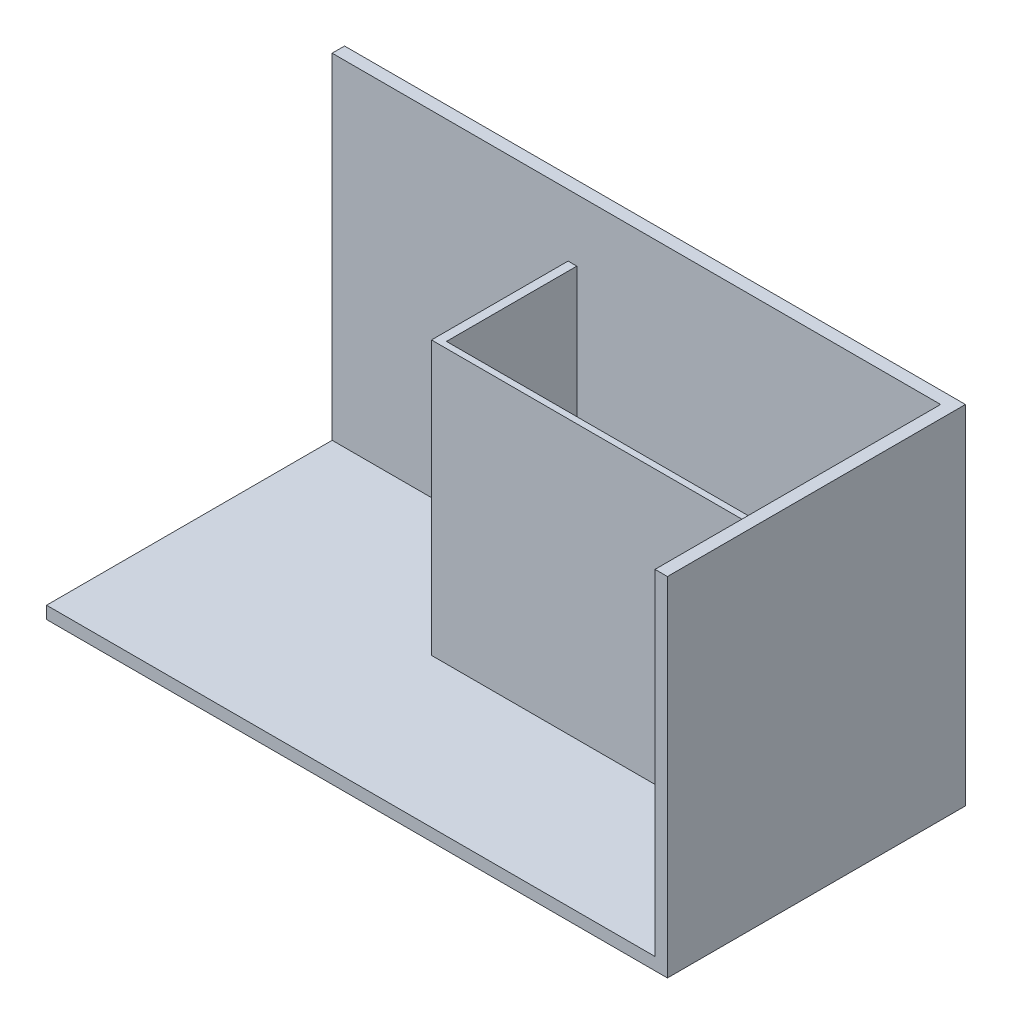
ISO-10303-21;
HEADER;
FILE_DESCRIPTION(('STEP AP214'),'2;1');
FILE_NAME('part.step','',(''),(''),'','','');
FILE_SCHEMA(('AUTOMOTIVE_DESIGN { 1 0 10303 214 1 1 1 1 }'));
ENDSEC;
DATA;
#1=APPLICATION_CONTEXT('core data for automotive mechanical design processes');
#2=APPLICATION_PROTOCOL_DEFINITION('international standard','automotive_design',2000,#1);
#3=PRODUCT_CONTEXT('',#1,'mechanical');
#4=PRODUCT('Part','Part','',(#3));
#5=PRODUCT_RELATED_PRODUCT_CATEGORY('part','',(#4));
#6=PRODUCT_DEFINITION_FORMATION('','',#4);
#7=PRODUCT_DEFINITION_CONTEXT('part definition',#1,'design');
#8=PRODUCT_DEFINITION('design','',#6,#7);
#9=PRODUCT_DEFINITION_SHAPE('','',#8);
#10=(LENGTH_UNIT() NAMED_UNIT(*) SI_UNIT(.MILLI.,.METRE.));
#11=(NAMED_UNIT(*) PLANE_ANGLE_UNIT() SI_UNIT($,.RADIAN.));
#12=(NAMED_UNIT(*) SI_UNIT($,.STERADIAN.) SOLID_ANGLE_UNIT());
#13=UNCERTAINTY_MEASURE_WITH_UNIT(LENGTH_MEASURE(1.E-05),#10,'distance_accuracy_value','');
#14=(GEOMETRIC_REPRESENTATION_CONTEXT(3) GLOBAL_UNCERTAINTY_ASSIGNED_CONTEXT((#13)) GLOBAL_UNIT_ASSIGNED_CONTEXT((#10,
#11,#12)) REPRESENTATION_CONTEXT('',''));
#15=CARTESIAN_POINT('',(0.,0.,0.));
#16=DIRECTION('',(0.,0.,1.));
#17=DIRECTION('',(1.,0.,0.));
#18=AXIS2_PLACEMENT_3D('',#15,#16,#17);
#19=CARTESIAN_POINT('',(0.,0.,0.));
#20=DIRECTION('',(0.,1.,0.));
#21=DIRECTION('',(0.,0.,1.));
#22=AXIS2_PLACEMENT_3D('',#19,#20,#21);
#23=PLANE('',#22);
#24=DIRECTION('',(0.,0.,-1.));
#25=VECTOR('',#24,1.);
#26=CARTESIAN_POINT('',(4833.64590230241,0.,-2344.42844317827));
#27=LINE('',#26,#25);
#28=CARTESIAN_POINT('',(4833.64590230241,0.,55.571556821729));
#29=VERTEX_POINT('',#28);
#30=CARTESIAN_POINT('',(4833.64590230241,0.,-1144.42844317827));
#31=VERTEX_POINT('',#30);
#32=EDGE_CURVE('E180',#29,#31,#27,.T.);
#33=ORIENTED_EDGE('',*,*,#32,.T.);
#34=DIRECTION('',(1.,0.,0.));
#35=VECTOR('',#34,1.);
#36=CARTESIAN_POINT('',(1833.64590230241,0.,-1144.42844317827));
#37=LINE('',#36,#35);
#38=CARTESIAN_POINT('',(1833.64590230241,0.,-1144.42844317827));
#39=VERTEX_POINT('',#38);
#40=EDGE_CURVE('E143',#39,#31,#37,.T.);
#41=ORIENTED_EDGE('',*,*,#40,.F.);
#42=DIRECTION('',(0.,0.,1.));
#43=VECTOR('',#42,1.);
#44=CARTESIAN_POINT('',(1833.64590230241,0.,-2244.42844317827));
#45=LINE('',#44,#43);
#46=CARTESIAN_POINT('',(1833.64590230241,0.,-2244.42844317827));
#47=VERTEX_POINT('',#46);
#48=EDGE_CURVE('E137',#47,#39,#45,.T.);
#49=ORIENTED_EDGE('',*,*,#48,.F.);
#50=DIRECTION('',(-1.,0.,0.));
#51=VECTOR('',#50,1.);
#52=CARTESIAN_POINT('',(4933.64590230241,0.,-2244.42844317827));
#53=LINE('',#52,#51);
#54=CARTESIAN_POINT('',(-66.3540976975871,0.,-2244.42844317827));
#55=VERTEX_POINT('',#54);
#56=EDGE_CURVE('E190',#47,#55,#53,.T.);
#57=ORIENTED_EDGE('',*,*,#56,.T.);
#58=DIRECTION('',(0.,0.,1.));
#59=VECTOR('',#58,1.);
#60=CARTESIAN_POINT('',(-66.3540976975871,0.,-2344.42844317827));
#61=LINE('',#60,#59);
#62=CARTESIAN_POINT('',(-66.3540976975868,0.,55.571556821729));
#63=VERTEX_POINT('',#62);
#64=EDGE_CURVE('E202',#55,#63,#61,.T.);
#65=ORIENTED_EDGE('',*,*,#64,.T.);
#66=DIRECTION('',(1.,0.,0.));
#67=VECTOR('',#66,1.);
#68=CARTESIAN_POINT('',(-66.3540976975868,0.,55.571556821729));
#69=LINE('',#68,#67);
#70=EDGE_CURVE('E209',#63,#29,#69,.T.);
#71=ORIENTED_EDGE('',*,*,#70,.T.);
#72=EDGE_LOOP('',(#33,#41,#49,#57,#65,#71));
#73=FACE_BOUND('',#72,.T.);
#74=ADVANCED_FACE('F35',(#73),#23,.T.);
#75=DIRECTION('',(0.,0.,-1.));
#76=VECTOR('',#75,1.);
#77=CARTESIAN_POINT('',(1904.0489280238,0.,-2244.42844317827));
#78=LINE('',#77,#76);
#79=CARTESIAN_POINT('',(1904.0489280238,0.,-1194.42844317827));
#80=VERTEX_POINT('',#79);
#81=CARTESIAN_POINT('',(1904.0489280238,0.,-2244.42844317827));
#82=VERTEX_POINT('',#81);
#83=EDGE_CURVE('E166',#80,#82,#78,.T.);
#84=ORIENTED_EDGE('',*,*,#83,.F.);
#85=DIRECTION('',(-1.,0.,0.));
#86=VECTOR('',#85,1.);
#87=CARTESIAN_POINT('',(1833.64590230241,0.,-1194.42844317827));
#88=LINE('',#87,#86);
#89=CARTESIAN_POINT('',(4833.64590230241,0.,-1194.42844317827));
#90=VERTEX_POINT('',#89);
#91=EDGE_CURVE('E153',#90,#80,#88,.T.);
#92=ORIENTED_EDGE('',*,*,#91,.F.);
#93=CARTESIAN_POINT('',(4833.64590230241,0.,-2244.42844317827));
#94=VERTEX_POINT('',#93);
#95=EDGE_CURVE('E179',#90,#94,#27,.T.);
#96=ORIENTED_EDGE('',*,*,#95,.T.);
#97=EDGE_CURVE('E186',#94,#82,#53,.T.);
#98=ORIENTED_EDGE('',*,*,#97,.T.);
#99=EDGE_LOOP('',(#84,#92,#96,#98));
#100=FACE_BOUND('',#99,.T.);
#101=ADVANCED_FACE('F261',(#100),#23,.T.);
#102=CARTESIAN_POINT('',(4833.64590230241,0.,0.));
#103=DIRECTION('',(1.,0.,0.));
#104=DIRECTION('',(0.,0.,-1.));
#105=AXIS2_PLACEMENT_3D('',#102,#103,#104);
#106=PLANE('',#105);
#107=DIRECTION('',(0.,-1.,0.));
#108=VECTOR('',#107,1.);
#109=CARTESIAN_POINT('',(4833.64590230241,2200.,-1144.42844317827));
#110=LINE('',#109,#108);
#111=CARTESIAN_POINT('',(4833.64590230241,2200.,-1144.42844317827));
#112=VERTEX_POINT('',#111);
#113=EDGE_CURVE('E140',#112,#31,#110,.T.);
#114=ORIENTED_EDGE('',*,*,#113,.T.);
#115=ORIENTED_EDGE('',*,*,#32,.F.);
#116=DIRECTION('',(0.,-1.,0.));
#117=VECTOR('',#116,1.);
#118=CARTESIAN_POINT('',(4833.64590230241,0.,55.571556821729));
#119=LINE('',#118,#117);
#120=CARTESIAN_POINT('',(4833.64590230241,2700.,55.571556821729));
#121=VERTEX_POINT('',#120);
#122=EDGE_CURVE('E177',#121,#29,#119,.T.);
#123=ORIENTED_EDGE('',*,*,#122,.F.);
#124=DIRECTION('',(0.,0.,1.));
#125=VECTOR('',#124,1.);
#126=CARTESIAN_POINT('',(4833.64590230241,2700.,-2344.42844317827));
#127=LINE('',#126,#125);
#128=CARTESIAN_POINT('',(4833.64590230241,2700.,-2244.42844317827));
#129=VERTEX_POINT('',#128);
#130=EDGE_CURVE('E175',#129,#121,#127,.T.);
#131=ORIENTED_EDGE('',*,*,#130,.F.);
#132=DIRECTION('',(0.,1.,0.));
#133=VECTOR('',#132,1.);
#134=CARTESIAN_POINT('',(4833.64590230241,0.,-2244.42844317827));
#135=LINE('',#134,#133);
#136=EDGE_CURVE('E11',#94,#129,#135,.T.);
#137=ORIENTED_EDGE('',*,*,#136,.F.);
#138=ORIENTED_EDGE('',*,*,#95,.F.);
#139=DIRECTION('',(0.,-1.,0.));
#140=VECTOR('',#139,1.);
#141=CARTESIAN_POINT('',(4833.64590230241,2200.,-1194.42844317827));
#142=LINE('',#141,#140);
#143=CARTESIAN_POINT('',(4833.64590230241,2200.,-1194.42844317827));
#144=VERTEX_POINT('',#143);
#145=EDGE_CURVE('E148',#144,#90,#142,.T.);
#146=ORIENTED_EDGE('',*,*,#145,.F.);
#147=DIRECTION('',(0.,0.,-1.));
#148=VECTOR('',#147,1.);
#149=CARTESIAN_POINT('',(4833.64590230241,2200.,-1144.42844317827));
#150=LINE('',#149,#148);
#151=EDGE_CURVE('E131',#112,#144,#150,.T.);
#152=ORIENTED_EDGE('',*,*,#151,.F.);
#153=EDGE_LOOP('',(#114,#115,#123,#131,#137,#138,#146,#152));
#154=FACE_BOUND('',#153,.T.);
#155=ADVANCED_FACE('F151',(#154),#106,.F.);
#156=CARTESIAN_POINT('',(1904.0489280238,2200.,-2244.42844317827));
#157=DIRECTION('',(-1.,0.,0.));
#158=DIRECTION('',(0.,0.,1.));
#159=AXIS2_PLACEMENT_3D('',#156,#157,#158);
#160=PLANE('',#159);
#161=DIRECTION('',(0.,1.,0.));
#162=VECTOR('',#161,1.);
#163=CARTESIAN_POINT('',(1904.0489280238,2200.,-1194.42844317827));
#164=LINE('',#163,#162);
#165=CARTESIAN_POINT('',(1904.0489280238,2200.,-1194.42844317827));
#166=VERTEX_POINT('',#165);
#167=EDGE_CURVE('E147',#80,#166,#164,.T.);
#168=ORIENTED_EDGE('',*,*,#167,.F.);
#169=ORIENTED_EDGE('',*,*,#83,.T.);
#170=DIRECTION('',(0.,-1.,0.));
#171=VECTOR('',#170,1.);
#172=CARTESIAN_POINT('',(1904.0489280238,2200.,-2244.42844317827));
#173=LINE('',#172,#171);
#174=CARTESIAN_POINT('',(1904.0489280238,2200.,-2244.42844317827));
#175=VERTEX_POINT('',#174);
#176=EDGE_CURVE('E172',#175,#82,#173,.T.);
#177=ORIENTED_EDGE('',*,*,#176,.F.);
#178=DIRECTION('',(0.,0.,-1.));
#179=VECTOR('',#178,1.);
#180=CARTESIAN_POINT('',(1904.0489280238,2200.,-2244.42844317827));
#181=LINE('',#180,#179);
#182=EDGE_CURVE('E55',#166,#175,#181,.T.);
#183=ORIENTED_EDGE('',*,*,#182,.F.);
#184=EDGE_LOOP('',(#168,#169,#177,#183));
#185=FACE_BOUND('',#184,.T.);
#186=ADVANCED_FACE('F267',(#185),#160,.F.);
#187=CARTESIAN_POINT('',(0.,0.,-2244.42844317827));
#188=DIRECTION('',(0.,0.,1.));
#189=DIRECTION('',(1.,0.,0.));
#190=AXIS2_PLACEMENT_3D('',#187,#188,#189);
#191=PLANE('',#190);
#192=DIRECTION('',(-1.,0.,0.));
#193=VECTOR('',#192,1.);
#194=CARTESIAN_POINT('',(1833.64590230241,2200.,-2244.42844317827));
#195=LINE('',#194,#193);
#196=CARTESIAN_POINT('',(1833.64590230241,2200.,-2244.42844317827));
#197=VERTEX_POINT('',#196);
#198=EDGE_CURVE('E161',#175,#197,#195,.T.);
#199=ORIENTED_EDGE('',*,*,#198,.F.);
#200=ORIENTED_EDGE('',*,*,#176,.T.);
#201=ORIENTED_EDGE('',*,*,#97,.F.);
#202=ORIENTED_EDGE('',*,*,#136,.T.);
#203=DIRECTION('',(1.,0.,0.));
#204=VECTOR('',#203,1.);
#205=CARTESIAN_POINT('',(4933.64590230241,2700.,-2244.42844317827));
#206=LINE('',#205,#204);
#207=CARTESIAN_POINT('',(-66.3540976975865,2700.,-2244.42844317827));
#208=VERTEX_POINT('',#207);
#209=EDGE_CURVE('E193',#208,#129,#206,.T.);
#210=ORIENTED_EDGE('',*,*,#209,.F.);
#211=DIRECTION('',(0.,1.,0.));
#212=VECTOR('',#211,1.);
#213=CARTESIAN_POINT('',(-66.3540976975865,0.,-2244.42844317827));
#214=LINE('',#213,#212);
#215=EDGE_CURVE('E189',#55,#208,#214,.T.);
#216=ORIENTED_EDGE('',*,*,#215,.F.);
#217=ORIENTED_EDGE('',*,*,#56,.F.);
#218=DIRECTION('',(0.,-1.,0.));
#219=VECTOR('',#218,1.);
#220=CARTESIAN_POINT('',(1833.64590230241,2200.,-2244.42844317827));
#221=LINE('',#220,#219);
#222=EDGE_CURVE('E170',#197,#47,#221,.T.);
#223=ORIENTED_EDGE('',*,*,#222,.F.);
#224=EDGE_LOOP('',(#199,#200,#201,#202,#210,#216,#217,#223));
#225=FACE_BOUND('',#224,.T.);
#226=ADVANCED_FACE('F244',(#225),#191,.T.);
#227=CARTESIAN_POINT('',(-66.3540976975871,-100.,-2344.42844317827));
#228=DIRECTION('',(-1.,0.,0.));
#229=DIRECTION('',(0.,0.,1.));
#230=AXIS2_PLACEMENT_3D('',#227,#228,#229);
#231=PLANE('',#230);
#232=ORIENTED_EDGE('',*,*,#64,.F.);
#233=ORIENTED_EDGE('',*,*,#215,.T.);
#234=DIRECTION('',(0.,0.,-1.));
#235=VECTOR('',#234,1.);
#236=CARTESIAN_POINT('',(-66.3540976975865,2700.,-2244.42844317827));
#237=LINE('',#236,#235);
#238=CARTESIAN_POINT('',(-66.3540976975865,2700.,-2344.42844317827));
#239=VERTEX_POINT('',#238);
#240=EDGE_CURVE('E196',#208,#239,#237,.T.);
#241=ORIENTED_EDGE('',*,*,#240,.T.);
#242=DIRECTION('',(0.,1.,0.));
#243=VECTOR('',#242,1.);
#244=CARTESIAN_POINT('',(-66.3540976975871,-100.,-2344.42844317827));
#245=LINE('',#244,#243);
#246=CARTESIAN_POINT('',(-66.3540976975871,-100.,-2344.42844317827));
#247=VERTEX_POINT('',#246);
#248=EDGE_CURVE('E43',#247,#239,#245,.T.);
#249=ORIENTED_EDGE('',*,*,#248,.F.);
#250=DIRECTION('',(0.,0.,1.));
#251=VECTOR('',#250,1.);
#252=CARTESIAN_POINT('',(-66.3540976975871,-100.,-2344.42844317827));
#253=LINE('',#252,#251);
#254=CARTESIAN_POINT('',(-66.3540976975868,-100.,55.571556821729));
#255=VERTEX_POINT('',#254);
#256=EDGE_CURVE('E205',#247,#255,#253,.T.);
#257=ORIENTED_EDGE('',*,*,#256,.T.);
#258=DIRECTION('',(0.,1.,0.));
#259=VECTOR('',#258,1.);
#260=CARTESIAN_POINT('',(-66.3540976975868,-100.,55.571556821729));
#261=LINE('',#260,#259);
#262=EDGE_CURVE('E218',#255,#63,#261,.T.);
#263=ORIENTED_EDGE('',*,*,#262,.T.);
#264=EDGE_LOOP('',(#232,#233,#241,#249,#257,#263));
#265=FACE_BOUND('',#264,.T.);
#266=ADVANCED_FACE('F37',(#265),#231,.T.);
#267=CARTESIAN_POINT('',(-66.3540976975871,-100.,-2344.42844317827));
#268=DIRECTION('',(0.,0.,-1.));
#269=DIRECTION('',(-1.,0.,0.));
#270=AXIS2_PLACEMENT_3D('',#267,#268,#269);
#271=PLANE('',#270);
#272=DIRECTION('',(1.,0.,0.));
#273=VECTOR('',#272,1.);
#274=CARTESIAN_POINT('',(4933.64590230241,2700.,-2344.42844317827));
#275=LINE('',#274,#273);
#276=CARTESIAN_POINT('',(4933.64590230241,2700.,-2344.42844317827));
#277=VERTEX_POINT('',#276);
#278=EDGE_CURVE('E185',#239,#277,#275,.T.);
#279=ORIENTED_EDGE('',*,*,#278,.T.);
#280=DIRECTION('',(0.,1.,0.));
#281=VECTOR('',#280,1.);
#282=CARTESIAN_POINT('',(4933.64590230241,-100.,-2344.42844317827));
#283=LINE('',#282,#281);
#284=CARTESIAN_POINT('',(4933.64590230241,-100.,-2344.42844317827));
#285=VERTEX_POINT('',#284);
#286=EDGE_CURVE('E223',#285,#277,#283,.T.);
#287=ORIENTED_EDGE('',*,*,#286,.F.);
#288=DIRECTION('',(-1.,0.,0.));
#289=VECTOR('',#288,1.);
#290=CARTESIAN_POINT('',(-66.3540976975871,-100.,-2344.42844317827));
#291=LINE('',#290,#289);
#292=EDGE_CURVE('E215',#285,#247,#291,.T.);
#293=ORIENTED_EDGE('',*,*,#292,.T.);
#294=ORIENTED_EDGE('',*,*,#248,.T.);
#295=EDGE_LOOP('',(#279,#287,#293,#294));
#296=FACE_BOUND('',#295,.T.);
#297=ADVANCED_FACE('F250',(#296),#271,.T.);
#298=CARTESIAN_POINT('',(4933.64590230241,-100.,-2344.42844317827));
#299=DIRECTION('',(1.,0.,0.));
#300=DIRECTION('',(0.,0.,-1.));
#301=AXIS2_PLACEMENT_3D('',#298,#299,#300);
#302=PLANE('',#301);
#303=ORIENTED_EDGE('',*,*,#286,.T.);
#304=DIRECTION('',(0.,0.,-1.));
#305=VECTOR('',#304,1.);
#306=CARTESIAN_POINT('',(4933.64590230241,2700.,-2244.42844317827));
#307=LINE('',#306,#305);
#308=CARTESIAN_POINT('',(4933.64590230241,2700.,55.571556821729));
#309=VERTEX_POINT('',#308);
#310=EDGE_CURVE('E199',#309,#277,#307,.T.);
#311=ORIENTED_EDGE('',*,*,#310,.F.);
#312=DIRECTION('',(0.,1.,0.));
#313=VECTOR('',#312,1.);
#314=CARTESIAN_POINT('',(4933.64590230241,-100.,55.571556821729));
#315=LINE('',#314,#313);
#316=CARTESIAN_POINT('',(4933.64590230241,-100.,55.571556821729));
#317=VERTEX_POINT('',#316);
#318=EDGE_CURVE('E225',#317,#309,#315,.T.);
#319=ORIENTED_EDGE('',*,*,#318,.F.);
#320=DIRECTION('',(0.,0.,-1.));
#321=VECTOR('',#320,1.);
#322=CARTESIAN_POINT('',(4933.64590230241,-100.,-2344.42844317827));
#323=LINE('',#322,#321);
#324=EDGE_CURVE('E212',#317,#285,#323,.T.);
#325=ORIENTED_EDGE('',*,*,#324,.T.);
#326=EDGE_LOOP('',(#303,#311,#319,#325));
#327=FACE_BOUND('',#326,.T.);
#328=ADVANCED_FACE('F256',(#327),#302,.T.);
#329=CARTESIAN_POINT('',(-66.3540976975868,-100.,55.571556821729));
#330=DIRECTION('',(0.,0.,1.));
#331=DIRECTION('',(1.,0.,0.));
#332=AXIS2_PLACEMENT_3D('',#329,#330,#331);
#333=PLANE('',#332);
#334=ORIENTED_EDGE('',*,*,#70,.F.);
#335=ORIENTED_EDGE('',*,*,#262,.F.);
#336=DIRECTION('',(1.,0.,0.));
#337=VECTOR('',#336,1.);
#338=CARTESIAN_POINT('',(-66.3540976975868,-100.,55.571556821729));
#339=LINE('',#338,#337);
#340=EDGE_CURVE('E208',#255,#317,#339,.T.);
#341=ORIENTED_EDGE('',*,*,#340,.T.);
#342=ORIENTED_EDGE('',*,*,#318,.T.);
#343=DIRECTION('',(1.,0.,0.));
#344=VECTOR('',#343,1.);
#345=CARTESIAN_POINT('',(4833.64590230241,2700.,55.571556821729));
#346=LINE('',#345,#344);
#347=EDGE_CURVE('E182',#121,#309,#346,.T.);
#348=ORIENTED_EDGE('',*,*,#347,.F.);
#349=ORIENTED_EDGE('',*,*,#122,.T.);
#350=EDGE_LOOP('',(#334,#335,#341,#342,#348,#349));
#351=FACE_BOUND('',#350,.T.);
#352=ADVANCED_FACE('F233',(#351),#333,.T.);
#353=CARTESIAN_POINT('',(0.,-100.,0.));
#354=DIRECTION('',(0.,1.,0.));
#355=DIRECTION('',(0.,0.,1.));
#356=AXIS2_PLACEMENT_3D('',#353,#354,#355);
#357=PLANE('',#356);
#358=ORIENTED_EDGE('',*,*,#256,.F.);
#359=ORIENTED_EDGE('',*,*,#292,.F.);
#360=ORIENTED_EDGE('',*,*,#324,.F.);
#361=ORIENTED_EDGE('',*,*,#340,.F.);
#362=EDGE_LOOP('',(#358,#359,#360,#361));
#363=FACE_BOUND('',#362,.T.);
#364=ADVANCED_FACE('F254',(#363),#357,.F.);
#365=CARTESIAN_POINT('',(4933.64590230241,2700.,-2244.42844317827));
#366=DIRECTION('',(0.,1.,0.));
#367=DIRECTION('',(0.,0.,1.));
#368=AXIS2_PLACEMENT_3D('',#365,#366,#367);
#369=PLANE('',#368);
#370=ORIENTED_EDGE('',*,*,#310,.T.);
#371=ORIENTED_EDGE('',*,*,#278,.F.);
#372=ORIENTED_EDGE('',*,*,#240,.F.);
#373=ORIENTED_EDGE('',*,*,#209,.T.);
#374=ORIENTED_EDGE('',*,*,#130,.T.);
#375=ORIENTED_EDGE('',*,*,#347,.T.);
#376=EDGE_LOOP('',(#370,#371,#372,#373,#374,#375));
#377=FACE_BOUND('',#376,.T.);
#378=ADVANCED_FACE('F247',(#377),#369,.T.);
#379=CARTESIAN_POINT('',(1833.64590230241,2200.,-1144.42844317827));
#380=DIRECTION('',(0.,0.,-1.));
#381=DIRECTION('',(-1.,0.,0.));
#382=AXIS2_PLACEMENT_3D('',#379,#380,#381);
#383=PLANE('',#382);
#384=ORIENTED_EDGE('',*,*,#40,.T.);
#385=ORIENTED_EDGE('',*,*,#113,.F.);
#386=DIRECTION('',(1.,0.,0.));
#387=VECTOR('',#386,1.);
#388=CARTESIAN_POINT('',(1833.64590230241,2200.,-1144.42844317827));
#389=LINE('',#388,#387);
#390=CARTESIAN_POINT('',(1833.64590230241,2200.,-1144.42844317827));
#391=VERTEX_POINT('',#390);
#392=EDGE_CURVE('E127',#391,#112,#389,.T.);
#393=ORIENTED_EDGE('',*,*,#392,.F.);
#394=DIRECTION('',(0.,-1.,0.));
#395=VECTOR('',#394,1.);
#396=CARTESIAN_POINT('',(1833.64590230241,2200.,-1144.42844317827));
#397=LINE('',#396,#395);
#398=EDGE_CURVE('E164',#391,#39,#397,.T.);
#399=ORIENTED_EDGE('',*,*,#398,.T.);
#400=EDGE_LOOP('',(#384,#385,#393,#399));
#401=FACE_BOUND('',#400,.T.);
#402=ADVANCED_FACE('F141',(#401),#383,.F.);
#403=CARTESIAN_POINT('',(1833.64590230241,2200.,-2244.42844317827));
#404=DIRECTION('',(1.,0.,0.));
#405=DIRECTION('',(0.,0.,-1.));
#406=AXIS2_PLACEMENT_3D('',#403,#404,#405);
#407=PLANE('',#406);
#408=ORIENTED_EDGE('',*,*,#398,.F.);
#409=DIRECTION('',(0.,0.,1.));
#410=VECTOR('',#409,1.);
#411=CARTESIAN_POINT('',(1833.64590230241,2200.,-2244.42844317827));
#412=LINE('',#411,#410);
#413=EDGE_CURVE('E133',#197,#391,#412,.T.);
#414=ORIENTED_EDGE('',*,*,#413,.F.);
#415=ORIENTED_EDGE('',*,*,#222,.T.);
#416=ORIENTED_EDGE('',*,*,#48,.T.);
#417=EDGE_LOOP('',(#408,#414,#415,#416));
#418=FACE_BOUND('',#417,.T.);
#419=ADVANCED_FACE('F269',(#418),#407,.F.);
#420=CARTESIAN_POINT('',(0.,2200.,0.));
#421=DIRECTION('',(0.,-1.,0.));
#422=DIRECTION('',(0.,0.,-1.));
#423=AXIS2_PLACEMENT_3D('',#420,#421,#422);
#424=PLANE('',#423);
#425=ORIENTED_EDGE('',*,*,#392,.T.);
#426=ORIENTED_EDGE('',*,*,#151,.T.);
#427=DIRECTION('',(-1.,0.,0.));
#428=VECTOR('',#427,1.);
#429=CARTESIAN_POINT('',(1833.64590230241,2200.,-1194.42844317827));
#430=LINE('',#429,#428);
#431=EDGE_CURVE('E50',#144,#166,#430,.T.);
#432=ORIENTED_EDGE('',*,*,#431,.T.);
#433=ORIENTED_EDGE('',*,*,#182,.T.);
#434=ORIENTED_EDGE('',*,*,#198,.T.);
#435=ORIENTED_EDGE('',*,*,#413,.T.);
#436=EDGE_LOOP('',(#425,#426,#432,#433,#434,#435));
#437=FACE_BOUND('',#436,.T.);
#438=ADVANCED_FACE('F129',(#437),#424,.F.);
#439=CARTESIAN_POINT('',(1833.64590230241,2200.,-1194.42844317827));
#440=DIRECTION('',(0.,0.,1.));
#441=DIRECTION('',(1.,0.,0.));
#442=AXIS2_PLACEMENT_3D('',#439,#440,#441);
#443=PLANE('',#442);
#444=ORIENTED_EDGE('',*,*,#91,.T.);
#445=ORIENTED_EDGE('',*,*,#167,.T.);
#446=ORIENTED_EDGE('',*,*,#431,.F.);
#447=ORIENTED_EDGE('',*,*,#145,.T.);
#448=EDGE_LOOP('',(#444,#445,#446,#447));
#449=FACE_BOUND('',#448,.T.);
#450=ADVANCED_FACE('F265',(#449),#443,.F.);
#451=CLOSED_SHELL('',(#74,#101,#155,#186,#226,#266,#297,#328,#352,#364,#378,#402,#419,#438,#450));
#452=MANIFOLD_SOLID_BREP('B2',#451);
#453=ADVANCED_BREP_SHAPE_REPRESENTATION('',(#18,#452),#14);
#454=SHAPE_DEFINITION_REPRESENTATION(#9,#453);
ENDSEC;
END-ISO-10303-21;
